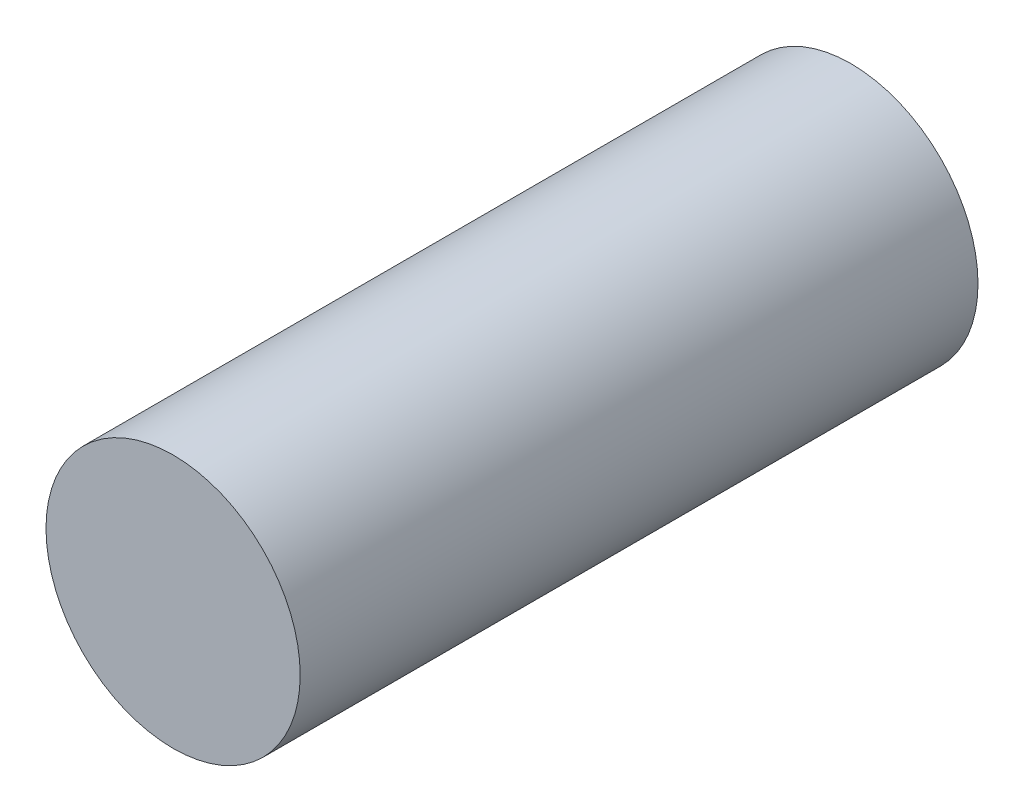
ISO-10303-21;
HEADER;
FILE_DESCRIPTION(('STEP AP214'),'2;1');
FILE_NAME('part.step','',(''),(''),'','','');
FILE_SCHEMA(('AUTOMOTIVE_DESIGN { 1 0 10303 214 1 1 1 1 }'));
ENDSEC;
DATA;
#1=APPLICATION_CONTEXT('core data for automotive mechanical design processes');
#2=APPLICATION_PROTOCOL_DEFINITION('international standard','automotive_design',2000,#1);
#3=PRODUCT_CONTEXT('',#1,'mechanical');
#4=PRODUCT('Part','Part','',(#3));
#5=PRODUCT_RELATED_PRODUCT_CATEGORY('part','',(#4));
#6=PRODUCT_DEFINITION_FORMATION('','',#4);
#7=PRODUCT_DEFINITION_CONTEXT('part definition',#1,'design');
#8=PRODUCT_DEFINITION('design','',#6,#7);
#9=PRODUCT_DEFINITION_SHAPE('','',#8);
#10=(LENGTH_UNIT() NAMED_UNIT(*) SI_UNIT(.MILLI.,.METRE.));
#11=(NAMED_UNIT(*) PLANE_ANGLE_UNIT() SI_UNIT($,.RADIAN.));
#12=(NAMED_UNIT(*) SI_UNIT($,.STERADIAN.) SOLID_ANGLE_UNIT());
#13=UNCERTAINTY_MEASURE_WITH_UNIT(LENGTH_MEASURE(1.E-05),#10,'distance_accuracy_value','');
#14=(GEOMETRIC_REPRESENTATION_CONTEXT(3) GLOBAL_UNCERTAINTY_ASSIGNED_CONTEXT((#13)) GLOBAL_UNIT_ASSIGNED_CONTEXT((#10,
#11,#12)) REPRESENTATION_CONTEXT('',''));
#15=CARTESIAN_POINT('',(0.,0.,0.));
#16=DIRECTION('',(0.,0.,1.));
#17=DIRECTION('',(1.,0.,0.));
#18=AXIS2_PLACEMENT_3D('',#15,#16,#17);
#19=CARTESIAN_POINT('',(0.,0.,16.));
#20=DIRECTION('',(0.,0.,-1.));
#21=DIRECTION('',(-1.,0.,0.));
#22=AXIS2_PLACEMENT_3D('',#19,#20,#21);
#23=CYLINDRICAL_SURFACE('',#22,3.);
#24=CARTESIAN_POINT('',(0.,0.,16.));
#25=DIRECTION('',(0.,0.,1.));
#26=DIRECTION('',(1.,0.,0.));
#27=AXIS2_PLACEMENT_3D('',#24,#25,#26);
#28=CIRCLE('',#27,3.);
#29=CARTESIAN_POINT('',(3.,0.,16.));
#30=VERTEX_POINT('',#29);
#31=EDGE_CURVE('E10',#30,#30,#28,.T.);
#32=ORIENTED_EDGE('',*,*,#31,.F.);
#33=EDGE_LOOP('',(#32));
#34=FACE_BOUND('',#33,.T.);
#35=CARTESIAN_POINT('',(0.,0.,0.));
#36=DIRECTION('',(0.,0.,1.));
#37=DIRECTION('',(1.,0.,0.));
#38=AXIS2_PLACEMENT_3D('',#35,#36,#37);
#39=CIRCLE('',#38,3.);
#40=CARTESIAN_POINT('',(3.,0.,0.));
#41=VERTEX_POINT('',#40);
#42=EDGE_CURVE('E42',#41,#41,#39,.T.);
#43=ORIENTED_EDGE('',*,*,#42,.T.);
#44=EDGE_LOOP('',(#43));
#45=FACE_BOUND('',#44,.T.);
#46=ADVANCED_FACE('F39',(#34,#45),#23,.T.);
#47=CARTESIAN_POINT('',(0.,0.,16.));
#48=DIRECTION('',(0.,0.,1.));
#49=DIRECTION('',(1.,0.,0.));
#50=AXIS2_PLACEMENT_3D('',#47,#48,#49);
#51=PLANE('',#50);
#52=ORIENTED_EDGE('',*,*,#31,.T.);
#53=EDGE_LOOP('',(#52));
#54=FACE_BOUND('',#53,.T.);
#55=ADVANCED_FACE('F54',(#54),#51,.T.);
#56=CARTESIAN_POINT('',(0.,0.,0.));
#57=DIRECTION('',(0.,0.,1.));
#58=DIRECTION('',(1.,0.,0.));
#59=AXIS2_PLACEMENT_3D('',#56,#57,#58);
#60=PLANE('',#59);
#61=ORIENTED_EDGE('',*,*,#42,.F.);
#62=EDGE_LOOP('',(#61));
#63=FACE_BOUND('',#62,.T.);
#64=ADVANCED_FACE('F52',(#63),#60,.F.);
#65=CLOSED_SHELL('',(#46,#55,#64));
#66=MANIFOLD_SOLID_BREP('B2',#65);
#67=ADVANCED_BREP_SHAPE_REPRESENTATION('',(#18,#66),#14);
#68=SHAPE_DEFINITION_REPRESENTATION(#9,#67);
ENDSEC;
END-ISO-10303-21;
